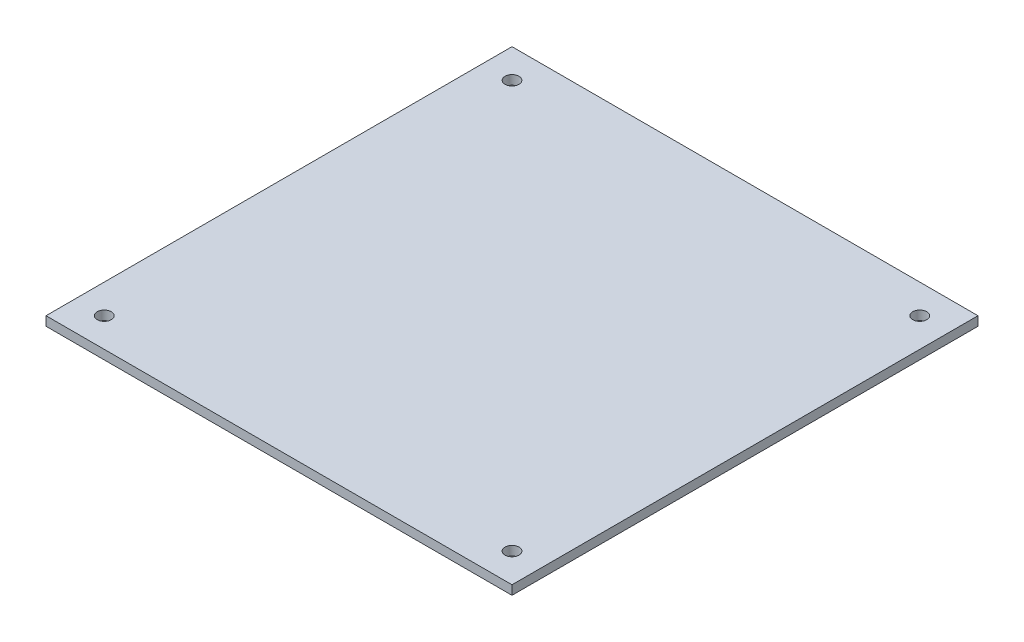
ISO-10303-21;
HEADER;
FILE_DESCRIPTION(('STEP AP214'),'2;1');
FILE_NAME('part.step','',(''),(''),'','','');
FILE_SCHEMA(('AUTOMOTIVE_DESIGN { 1 0 10303 214 1 1 1 1 }'));
ENDSEC;
DATA;
#1=APPLICATION_CONTEXT('core data for automotive mechanical design processes');
#2=APPLICATION_PROTOCOL_DEFINITION('international standard','automotive_design',2000,#1);
#3=PRODUCT_CONTEXT('',#1,'mechanical');
#4=PRODUCT('Part','Part','',(#3));
#5=PRODUCT_RELATED_PRODUCT_CATEGORY('part','',(#4));
#6=PRODUCT_DEFINITION_FORMATION('','',#4);
#7=PRODUCT_DEFINITION_CONTEXT('part definition',#1,'design');
#8=PRODUCT_DEFINITION('design','',#6,#7);
#9=PRODUCT_DEFINITION_SHAPE('','',#8);
#10=(LENGTH_UNIT() NAMED_UNIT(*) SI_UNIT(.MILLI.,.METRE.));
#11=(NAMED_UNIT(*) PLANE_ANGLE_UNIT() SI_UNIT($,.RADIAN.));
#12=(NAMED_UNIT(*) SI_UNIT($,.STERADIAN.) SOLID_ANGLE_UNIT());
#13=UNCERTAINTY_MEASURE_WITH_UNIT(LENGTH_MEASURE(1.E-05),#10,'distance_accuracy_value','');
#14=(GEOMETRIC_REPRESENTATION_CONTEXT(3) GLOBAL_UNCERTAINTY_ASSIGNED_CONTEXT((#13)) GLOBAL_UNIT_ASSIGNED_CONTEXT((#10,
#11,#12)) REPRESENTATION_CONTEXT('',''));
#15=CARTESIAN_POINT('',(0.,0.,0.));
#16=DIRECTION('',(0.,0.,1.));
#17=DIRECTION('',(1.,0.,0.));
#18=AXIS2_PLACEMENT_3D('',#15,#16,#17);
#19=CARTESIAN_POINT('',(50.8,2.,50.8));
#20=DIRECTION('',(0.,0.,1.));
#21=DIRECTION('',(1.,0.,0.));
#22=AXIS2_PLACEMENT_3D('',#19,#20,#21);
#23=PLANE('',#22);
#24=DIRECTION('',(-1.,0.,0.));
#25=VECTOR('',#24,1.);
#26=CARTESIAN_POINT('',(50.8,0.,50.8));
#27=LINE('',#26,#25);
#28=CARTESIAN_POINT('',(50.8,0.,50.8));
#29=VERTEX_POINT('',#28);
#30=CARTESIAN_POINT('',(-50.8,0.,50.8));
#31=VERTEX_POINT('',#30);
#32=EDGE_CURVE('E103',#29,#31,#27,.T.);
#33=ORIENTED_EDGE('',*,*,#32,.F.);
#34=DIRECTION('',(0.,-1.,0.));
#35=VECTOR('',#34,1.);
#36=CARTESIAN_POINT('',(50.8,2.,50.8));
#37=LINE('',#36,#35);
#38=CARTESIAN_POINT('',(50.8,2.,50.8));
#39=VERTEX_POINT('',#38);
#40=EDGE_CURVE('E11',#39,#29,#37,.T.);
#41=ORIENTED_EDGE('',*,*,#40,.F.);
#42=DIRECTION('',(-1.,0.,0.));
#43=VECTOR('',#42,1.);
#44=CARTESIAN_POINT('',(50.8,2.,50.8));
#45=LINE('',#44,#43);
#46=CARTESIAN_POINT('',(-50.8,2.,50.8));
#47=VERTEX_POINT('',#46);
#48=EDGE_CURVE('E97',#39,#47,#45,.T.);
#49=ORIENTED_EDGE('',*,*,#48,.T.);
#50=DIRECTION('',(0.,-1.,0.));
#51=VECTOR('',#50,1.);
#52=CARTESIAN_POINT('',(-50.8,2.,50.8));
#53=LINE('',#52,#51);
#54=EDGE_CURVE('E40',#47,#31,#53,.T.);
#55=ORIENTED_EDGE('',*,*,#54,.T.);
#56=EDGE_LOOP('',(#33,#41,#49,#55));
#57=FACE_BOUND('',#56,.T.);
#58=ADVANCED_FACE('F37',(#57),#23,.T.);
#59=CARTESIAN_POINT('',(50.8,2.,50.8));
#60=DIRECTION('',(-1.,0.,0.));
#61=DIRECTION('',(0.,0.,1.));
#62=AXIS2_PLACEMENT_3D('',#59,#60,#61);
#63=PLANE('',#62);
#64=DIRECTION('',(0.,0.,-1.));
#65=VECTOR('',#64,1.);
#66=CARTESIAN_POINT('',(50.8,0.,50.8));
#67=LINE('',#66,#65);
#68=CARTESIAN_POINT('',(50.8,0.,-50.8));
#69=VERTEX_POINT('',#68);
#70=EDGE_CURVE('E70',#29,#69,#67,.T.);
#71=ORIENTED_EDGE('',*,*,#70,.T.);
#72=DIRECTION('',(0.,-1.,0.));
#73=VECTOR('',#72,1.);
#74=CARTESIAN_POINT('',(50.8,2.,-50.8));
#75=LINE('',#74,#73);
#76=CARTESIAN_POINT('',(50.8,2.,-50.8));
#77=VERTEX_POINT('',#76);
#78=EDGE_CURVE('E46',#77,#69,#75,.T.);
#79=ORIENTED_EDGE('',*,*,#78,.F.);
#80=DIRECTION('',(0.,0.,-1.));
#81=VECTOR('',#80,1.);
#82=CARTESIAN_POINT('',(50.8,2.,50.8));
#83=LINE('',#82,#81);
#84=EDGE_CURVE('E87',#39,#77,#83,.T.);
#85=ORIENTED_EDGE('',*,*,#84,.F.);
#86=ORIENTED_EDGE('',*,*,#40,.T.);
#87=EDGE_LOOP('',(#71,#79,#85,#86));
#88=FACE_BOUND('',#87,.T.);
#89=ADVANCED_FACE('F114',(#88),#63,.F.);
#90=CARTESIAN_POINT('',(50.8,2.,-50.8));
#91=DIRECTION('',(0.,0.,1.));
#92=DIRECTION('',(1.,0.,0.));
#93=AXIS2_PLACEMENT_3D('',#90,#91,#92);
#94=PLANE('',#93);
#95=DIRECTION('',(-1.,0.,0.));
#96=VECTOR('',#95,1.);
#97=CARTESIAN_POINT('',(50.8,0.,-50.8));
#98=LINE('',#97,#96);
#99=CARTESIAN_POINT('',(-50.8,0.,-50.8));
#100=VERTEX_POINT('',#99);
#101=EDGE_CURVE('E94',#69,#100,#98,.T.);
#102=ORIENTED_EDGE('',*,*,#101,.T.);
#103=DIRECTION('',(0.,-1.,0.));
#104=VECTOR('',#103,1.);
#105=CARTESIAN_POINT('',(-50.8,2.,-50.8));
#106=LINE('',#105,#104);
#107=CARTESIAN_POINT('',(-50.8,2.,-50.8));
#108=VERTEX_POINT('',#107);
#109=EDGE_CURVE('E91',#108,#100,#106,.T.);
#110=ORIENTED_EDGE('',*,*,#109,.F.);
#111=DIRECTION('',(-1.,0.,0.));
#112=VECTOR('',#111,1.);
#113=CARTESIAN_POINT('',(50.8,2.,-50.8));
#114=LINE('',#113,#112);
#115=EDGE_CURVE('E82',#77,#108,#114,.T.);
#116=ORIENTED_EDGE('',*,*,#115,.F.);
#117=ORIENTED_EDGE('',*,*,#78,.T.);
#118=EDGE_LOOP('',(#102,#110,#116,#117));
#119=FACE_BOUND('',#118,.T.);
#120=ADVANCED_FACE('F92',(#119),#94,.F.);
#121=CARTESIAN_POINT('',(-50.8,2.,50.8));
#122=DIRECTION('',(-1.,0.,0.));
#123=DIRECTION('',(0.,0.,1.));
#124=AXIS2_PLACEMENT_3D('',#121,#122,#123);
#125=PLANE('',#124);
#126=DIRECTION('',(0.,0.,-1.));
#127=VECTOR('',#126,1.);
#128=CARTESIAN_POINT('',(-50.8,0.,50.8));
#129=LINE('',#128,#127);
#130=EDGE_CURVE('E106',#31,#100,#129,.T.);
#131=ORIENTED_EDGE('',*,*,#130,.F.);
#132=ORIENTED_EDGE('',*,*,#54,.F.);
#133=DIRECTION('',(0.,0.,-1.));
#134=VECTOR('',#133,1.);
#135=CARTESIAN_POINT('',(-50.8,2.,50.8));
#136=LINE('',#135,#134);
#137=EDGE_CURVE('E86',#47,#108,#136,.T.);
#138=ORIENTED_EDGE('',*,*,#137,.T.);
#139=ORIENTED_EDGE('',*,*,#109,.T.);
#140=EDGE_LOOP('',(#131,#132,#138,#139));
#141=FACE_BOUND('',#140,.T.);
#142=ADVANCED_FACE('F96',(#141),#125,.T.);
#143=CARTESIAN_POINT('',(0.,2.,0.));
#144=DIRECTION('',(0.,-1.,0.));
#145=DIRECTION('',(0.,0.,-1.));
#146=AXIS2_PLACEMENT_3D('',#143,#144,#145);
#147=PLANE('',#146);
#148=CARTESIAN_POINT('',(-44.45,2.,-44.45));
#149=DIRECTION('',(0.,1.,0.));
#150=DIRECTION('',(0.,0.,1.));
#151=AXIS2_PLACEMENT_3D('',#148,#149,#150);
#152=CIRCLE('',#151,1.524);
#153=CARTESIAN_POINT('',(-44.45,2.,-42.926));
#154=VERTEX_POINT('',#153);
#155=EDGE_CURVE('E175',#154,#154,#152,.T.);
#156=ORIENTED_EDGE('',*,*,#155,.F.);
#157=EDGE_LOOP('',(#156));
#158=FACE_BOUND('',#157,.T.);
#159=CARTESIAN_POINT('',(44.45,2.,-44.45));
#160=DIRECTION('',(0.,1.,0.));
#161=DIRECTION('',(0.,0.,1.));
#162=AXIS2_PLACEMENT_3D('',#159,#160,#161);
#163=CIRCLE('',#162,1.524);
#164=CARTESIAN_POINT('',(44.45,2.,-42.926));
#165=VERTEX_POINT('',#164);
#166=EDGE_CURVE('E167',#165,#165,#163,.T.);
#167=ORIENTED_EDGE('',*,*,#166,.F.);
#168=EDGE_LOOP('',(#167));
#169=FACE_BOUND('',#168,.T.);
#170=CARTESIAN_POINT('',(44.45,2.,44.45));
#171=DIRECTION('',(0.,1.,0.));
#172=DIRECTION('',(0.,0.,1.));
#173=AXIS2_PLACEMENT_3D('',#170,#171,#172);
#174=CIRCLE('',#173,1.524);
#175=CARTESIAN_POINT('',(44.45,2.,45.974));
#176=VERTEX_POINT('',#175);
#177=EDGE_CURVE('E160',#176,#176,#174,.T.);
#178=ORIENTED_EDGE('',*,*,#177,.F.);
#179=EDGE_LOOP('',(#178));
#180=FACE_BOUND('',#179,.T.);
#181=CARTESIAN_POINT('',(-44.45,2.,44.45));
#182=DIRECTION('',(0.,1.,0.));
#183=DIRECTION('',(0.,0.,1.));
#184=AXIS2_PLACEMENT_3D('',#181,#182,#183);
#185=CIRCLE('',#184,1.524);
#186=CARTESIAN_POINT('',(-44.45,2.,45.974));
#187=VERTEX_POINT('',#186);
#188=EDGE_CURVE('E164',#187,#187,#185,.T.);
#189=ORIENTED_EDGE('',*,*,#188,.F.);
#190=EDGE_LOOP('',(#189));
#191=FACE_BOUND('',#190,.T.);
#192=ORIENTED_EDGE('',*,*,#48,.F.);
#193=ORIENTED_EDGE('',*,*,#84,.T.);
#194=ORIENTED_EDGE('',*,*,#115,.T.);
#195=ORIENTED_EDGE('',*,*,#137,.F.);
#196=EDGE_LOOP('',(#192,#193,#194,#195));
#197=FACE_BOUND('',#196,.T.);
#198=ADVANCED_FACE('F85',(#158,#169,#180,#191,#197),#147,.F.);
#199=CARTESIAN_POINT('',(0.,0.,0.));
#200=DIRECTION('',(0.,-1.,0.));
#201=DIRECTION('',(0.,0.,-1.));
#202=AXIS2_PLACEMENT_3D('',#199,#200,#201);
#203=PLANE('',#202);
#204=CARTESIAN_POINT('',(-44.45,0.,-44.45));
#205=DIRECTION('',(0.,1.,0.));
#206=DIRECTION('',(0.,0.,1.));
#207=AXIS2_PLACEMENT_3D('',#204,#205,#206);
#208=CIRCLE('',#207,1.524);
#209=CARTESIAN_POINT('',(-44.45,0.,-42.926));
#210=VERTEX_POINT('',#209);
#211=EDGE_CURVE('E172',#210,#210,#208,.T.);
#212=ORIENTED_EDGE('',*,*,#211,.T.);
#213=EDGE_LOOP('',(#212));
#214=FACE_BOUND('',#213,.T.);
#215=CARTESIAN_POINT('',(44.45,0.,-44.45));
#216=DIRECTION('',(0.,1.,0.));
#217=DIRECTION('',(0.,0.,1.));
#218=AXIS2_PLACEMENT_3D('',#215,#216,#217);
#219=CIRCLE('',#218,1.524);
#220=CARTESIAN_POINT('',(44.45,0.,-42.926));
#221=VERTEX_POINT('',#220);
#222=EDGE_CURVE('E162',#221,#221,#219,.T.);
#223=ORIENTED_EDGE('',*,*,#222,.T.);
#224=EDGE_LOOP('',(#223));
#225=FACE_BOUND('',#224,.T.);
#226=CARTESIAN_POINT('',(44.45,0.,44.45));
#227=DIRECTION('',(0.,1.,0.));
#228=DIRECTION('',(0.,0.,1.));
#229=AXIS2_PLACEMENT_3D('',#226,#227,#228);
#230=CIRCLE('',#229,1.524);
#231=CARTESIAN_POINT('',(44.45,0.,45.974));
#232=VERTEX_POINT('',#231);
#233=EDGE_CURVE('E157',#232,#232,#230,.T.);
#234=ORIENTED_EDGE('',*,*,#233,.T.);
#235=EDGE_LOOP('',(#234));
#236=FACE_BOUND('',#235,.T.);
#237=CARTESIAN_POINT('',(-44.45,0.,44.45));
#238=DIRECTION('',(0.,1.,0.));
#239=DIRECTION('',(0.,0.,1.));
#240=AXIS2_PLACEMENT_3D('',#237,#238,#239);
#241=CIRCLE('',#240,1.524);
#242=CARTESIAN_POINT('',(-44.45,0.,45.974));
#243=VERTEX_POINT('',#242);
#244=EDGE_CURVE('E107',#243,#243,#241,.T.);
#245=ORIENTED_EDGE('',*,*,#244,.T.);
#246=EDGE_LOOP('',(#245));
#247=FACE_BOUND('',#246,.T.);
#248=ORIENTED_EDGE('',*,*,#32,.T.);
#249=ORIENTED_EDGE('',*,*,#130,.T.);
#250=ORIENTED_EDGE('',*,*,#101,.F.);
#251=ORIENTED_EDGE('',*,*,#70,.F.);
#252=EDGE_LOOP('',(#248,#249,#250,#251));
#253=FACE_BOUND('',#252,.T.);
#254=ADVANCED_FACE('F112',(#214,#225,#236,#247,#253),#203,.T.);
#255=CARTESIAN_POINT('',(-44.45,0.,44.45));
#256=DIRECTION('',(0.,1.,0.));
#257=DIRECTION('',(0.,0.,1.));
#258=AXIS2_PLACEMENT_3D('',#255,#256,#257);
#259=CYLINDRICAL_SURFACE('',#258,1.524);
#260=ORIENTED_EDGE('',*,*,#244,.F.);
#261=EDGE_LOOP('',(#260));
#262=FACE_BOUND('',#261,.T.);
#263=ORIENTED_EDGE('',*,*,#188,.T.);
#264=EDGE_LOOP('',(#263));
#265=FACE_BOUND('',#264,.T.);
#266=ADVANCED_FACE('F133',(#262,#265),#259,.F.);
#267=CARTESIAN_POINT('',(44.45,0.,44.45));
#268=DIRECTION('',(0.,1.,0.));
#269=DIRECTION('',(0.,0.,1.));
#270=AXIS2_PLACEMENT_3D('',#267,#268,#269);
#271=CYLINDRICAL_SURFACE('',#270,1.524);
#272=ORIENTED_EDGE('',*,*,#233,.F.);
#273=EDGE_LOOP('',(#272));
#274=FACE_BOUND('',#273,.T.);
#275=ORIENTED_EDGE('',*,*,#177,.T.);
#276=EDGE_LOOP('',(#275));
#277=FACE_BOUND('',#276,.T.);
#278=ADVANCED_FACE('F140',(#274,#277),#271,.F.);
#279=CARTESIAN_POINT('',(44.45,0.,-44.45));
#280=DIRECTION('',(0.,1.,0.));
#281=DIRECTION('',(0.,0.,1.));
#282=AXIS2_PLACEMENT_3D('',#279,#280,#281);
#283=CYLINDRICAL_SURFACE('',#282,1.524);
#284=ORIENTED_EDGE('',*,*,#222,.F.);
#285=EDGE_LOOP('',(#284));
#286=FACE_BOUND('',#285,.T.);
#287=ORIENTED_EDGE('',*,*,#166,.T.);
#288=EDGE_LOOP('',(#287));
#289=FACE_BOUND('',#288,.T.);
#290=ADVANCED_FACE('F145',(#286,#289),#283,.F.);
#291=CARTESIAN_POINT('',(-44.45,0.,-44.45));
#292=DIRECTION('',(0.,1.,0.));
#293=DIRECTION('',(0.,0.,1.));
#294=AXIS2_PLACEMENT_3D('',#291,#292,#293);
#295=CYLINDRICAL_SURFACE('',#294,1.524);
#296=ORIENTED_EDGE('',*,*,#211,.F.);
#297=EDGE_LOOP('',(#296));
#298=FACE_BOUND('',#297,.T.);
#299=ORIENTED_EDGE('',*,*,#155,.T.);
#300=EDGE_LOOP('',(#299));
#301=FACE_BOUND('',#300,.T.);
#302=ADVANCED_FACE('F142',(#298,#301),#295,.F.);
#303=CLOSED_SHELL('',(#58,#89,#120,#142,#198,#254,#266,#278,#290,#302));
#304=MANIFOLD_SOLID_BREP('B2',#303);
#305=ADVANCED_BREP_SHAPE_REPRESENTATION('',(#18,#304),#14);
#306=SHAPE_DEFINITION_REPRESENTATION(#9,#305);
ENDSEC;
END-ISO-10303-21;
